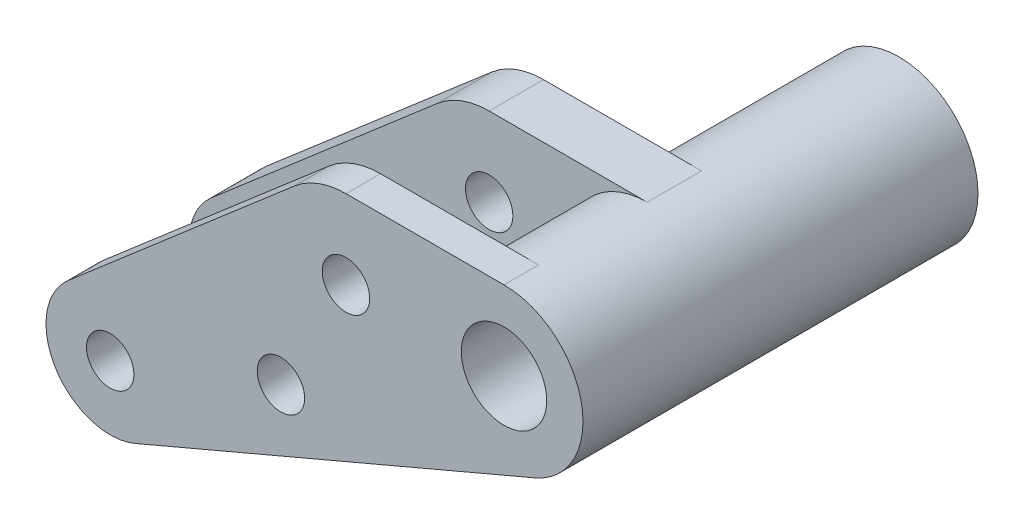
ISO-10303-21;
HEADER;
FILE_DESCRIPTION(('STEP AP214'),'2;1');
FILE_NAME('part.step','',(''),(''),'','','');
FILE_SCHEMA(('AUTOMOTIVE_DESIGN { 1 0 10303 214 1 1 1 1 }'));
ENDSEC;
DATA;
#1=APPLICATION_CONTEXT('core data for automotive mechanical design processes');
#2=APPLICATION_PROTOCOL_DEFINITION('international standard','automotive_design',2000,#1);
#3=PRODUCT_CONTEXT('',#1,'mechanical');
#4=PRODUCT('Part','Part','',(#3));
#5=PRODUCT_RELATED_PRODUCT_CATEGORY('part','',(#4));
#6=PRODUCT_DEFINITION_FORMATION('','',#4);
#7=PRODUCT_DEFINITION_CONTEXT('part definition',#1,'design');
#8=PRODUCT_DEFINITION('design','',#6,#7);
#9=PRODUCT_DEFINITION_SHAPE('','',#8);
#10=(LENGTH_UNIT() NAMED_UNIT(*) SI_UNIT(.MILLI.,.METRE.));
#11=(NAMED_UNIT(*) PLANE_ANGLE_UNIT() SI_UNIT($,.RADIAN.));
#12=(NAMED_UNIT(*) SI_UNIT($,.STERADIAN.) SOLID_ANGLE_UNIT());
#13=UNCERTAINTY_MEASURE_WITH_UNIT(LENGTH_MEASURE(1.E-05),#10,'distance_accuracy_value','');
#14=(GEOMETRIC_REPRESENTATION_CONTEXT(3) GLOBAL_UNCERTAINTY_ASSIGNED_CONTEXT((#13)) GLOBAL_UNIT_ASSIGNED_CONTEXT((#10,
#11,#12)) REPRESENTATION_CONTEXT('',''));
#15=CARTESIAN_POINT('',(0.,0.,0.));
#16=DIRECTION('',(0.,0.,1.));
#17=DIRECTION('',(1.,0.,0.));
#18=AXIS2_PLACEMENT_3D('',#15,#16,#17);
#19=CARTESIAN_POINT('',(-12.7,0.,-15.875));
#20=DIRECTION('',(0.,0.,1.));
#21=DIRECTION('',(1.,0.,0.));
#22=AXIS2_PLACEMENT_3D('',#19,#20,#21);
#23=CYLINDRICAL_SURFACE('',#22,6.35);
#24=DIRECTION('',(0.,0.,1.));
#25=VECTOR('',#24,1.);
#26=CARTESIAN_POINT('',(-16.8451479640385,4.81043120273306,-15.875));
#27=LINE('',#26,#25);
#28=CARTESIAN_POINT('',(-16.8451479640385,4.81043120273306,-15.875));
#29=VERTEX_POINT('',#28);
#30=CARTESIAN_POINT('',(-16.8451479640385,4.81043120273306,-11.509375));
#31=VERTEX_POINT('',#30);
#32=EDGE_CURVE('E117',#29,#31,#27,.T.);
#33=ORIENTED_EDGE('',*,*,#32,.T.);
#34=CARTESIAN_POINT('',(-12.7,0.,-11.509375));
#35=DIRECTION('',(0.,0.,1.));
#36=DIRECTION('',(1.,0.,0.));
#37=AXIS2_PLACEMENT_3D('',#34,#35,#36);
#38=CIRCLE('',#37,6.35);
#39=CARTESIAN_POINT('',(-12.7,6.35,-11.509375));
#40=VERTEX_POINT('',#39);
#41=EDGE_CURVE('E310',#40,#31,#38,.T.);
#42=ORIENTED_EDGE('',*,*,#41,.F.);
#43=DIRECTION('',(0.,0.,1.));
#44=VECTOR('',#43,1.);
#45=CARTESIAN_POINT('',(-12.7,6.35,-15.875));
#46=LINE('',#45,#44);
#47=CARTESIAN_POINT('',(-12.7,6.35,-15.875));
#48=VERTEX_POINT('',#47);
#49=EDGE_CURVE('E57',#48,#40,#46,.T.);
#50=ORIENTED_EDGE('',*,*,#49,.F.);
#51=CARTESIAN_POINT('',(-12.7,0.,-15.875));
#52=DIRECTION('',(0.,0.,1.));
#53=DIRECTION('',(1.,0.,0.));
#54=AXIS2_PLACEMENT_3D('',#51,#52,#53);
#55=CIRCLE('',#54,6.35);
#56=EDGE_CURVE('E164',#48,#29,#55,.T.);
#57=ORIENTED_EDGE('',*,*,#56,.T.);
#58=EDGE_LOOP('',(#33,#42,#50,#57));
#59=FACE_BOUND('',#58,.T.);
#60=ADVANCED_FACE('F47',(#59),#23,.T.);
#61=CARTESIAN_POINT('',(-12.7,6.35,-15.875));
#62=DIRECTION('',(0.,1.,0.));
#63=DIRECTION('',(0.,0.,1.));
#64=AXIS2_PLACEMENT_3D('',#61,#62,#63);
#65=PLANE('',#64);
#66=ORIENTED_EDGE('',*,*,#49,.T.);
#67=DIRECTION('',(-1.,0.,0.));
#68=VECTOR('',#67,1.);
#69=CARTESIAN_POINT('',(0.,6.35,-11.509375));
#70=LINE('',#69,#68);
#71=CARTESIAN_POINT('',(0.,6.35,-11.509375));
#72=VERTEX_POINT('',#71);
#73=EDGE_CURVE('E253',#72,#40,#70,.T.);
#74=ORIENTED_EDGE('',*,*,#73,.F.);
#75=DIRECTION('',(0.,0.,1.));
#76=VECTOR('',#75,1.);
#77=CARTESIAN_POINT('',(0.,6.35,-15.875));
#78=LINE('',#77,#76);
#79=CARTESIAN_POINT('',(0.,6.35,-15.875));
#80=VERTEX_POINT('',#79);
#81=EDGE_CURVE('E193',#80,#72,#78,.T.);
#82=ORIENTED_EDGE('',*,*,#81,.F.);
#83=DIRECTION('',(-1.,0.,0.));
#84=VECTOR('',#83,1.);
#85=CARTESIAN_POINT('',(-12.7,6.35,-15.875));
#86=LINE('',#85,#84);
#87=EDGE_CURVE('E154',#80,#48,#86,.T.);
#88=ORIENTED_EDGE('',*,*,#87,.T.);
#89=EDGE_LOOP('',(#66,#74,#82,#88));
#90=FACE_BOUND('',#89,.T.);
#91=ADVANCED_FACE('F248',(#90),#65,.T.);
#92=CARTESIAN_POINT('',(-31.652799462255,-14.759942791294,-15.875));
#93=DIRECTION('',(0.,0.,1.));
#94=DIRECTION('',(1.,0.,0.));
#95=AXIS2_PLACEMENT_3D('',#92,#93,#94);
#96=CYLINDRICAL_SURFACE('',#95,5.159375);
#97=DIRECTION('',(0.,0.,1.));
#98=VECTOR('',#97,1.);
#99=CARTESIAN_POINT('',(-29.6330292512172,-19.5075399398766,-15.875));
#100=LINE('',#99,#98);
#101=CARTESIAN_POINT('',(-29.6330292512172,-19.5075399398766,-15.875));
#102=VERTEX_POINT('',#101);
#103=CARTESIAN_POINT('',(-29.6330292512172,-19.5075399398766,-11.509375));
#104=VERTEX_POINT('',#103);
#105=EDGE_CURVE('E131',#102,#104,#100,.T.);
#106=ORIENTED_EDGE('',*,*,#105,.T.);
#107=CARTESIAN_POINT('',(-31.652799462255,-14.759942791294,-11.509375));
#108=DIRECTION('',(0.,0.,1.));
#109=DIRECTION('',(1.,0.,0.));
#110=AXIS2_PLACEMENT_3D('',#107,#108,#109);
#111=CIRCLE('',#110,5.159375);
#112=CARTESIAN_POINT('',(-35.0207321830362,-10.8514674390734,-11.509375));
#113=VERTEX_POINT('',#112);
#114=EDGE_CURVE('E275',#113,#104,#111,.T.);
#115=ORIENTED_EDGE('',*,*,#114,.F.);
#116=DIRECTION('',(0.,0.,1.));
#117=VECTOR('',#116,1.);
#118=CARTESIAN_POINT('',(-35.0207321830362,-10.8514674390734,-15.875));
#119=LINE('',#118,#117);
#120=CARTESIAN_POINT('',(-35.0207321830362,-10.8514674390734,-15.875));
#121=VERTEX_POINT('',#120);
#122=EDGE_CURVE('E158',#121,#113,#119,.T.);
#123=ORIENTED_EDGE('',*,*,#122,.F.);
#124=CARTESIAN_POINT('',(-31.652799462255,-14.759942791294,-15.875));
#125=DIRECTION('',(0.,0.,1.));
#126=DIRECTION('',(1.,0.,0.));
#127=AXIS2_PLACEMENT_3D('',#124,#125,#126);
#128=CIRCLE('',#127,5.159375);
#129=EDGE_CURVE('E150',#121,#102,#128,.T.);
#130=ORIENTED_EDGE('',*,*,#129,.T.);
#131=EDGE_LOOP('',(#106,#115,#123,#130));
#132=FACE_BOUND('',#131,.T.);
#133=ADVANCED_FACE('F156',(#132),#96,.T.);
#134=CARTESIAN_POINT('',(-35.0207321830362,-10.8514674390734,-15.875));
#135=DIRECTION('',(-0.652779206935191,0.757548220902843,0.));
#136=DIRECTION('',(-0.757548220902844,-0.652779206935191,0.));
#137=AXIS2_PLACEMENT_3D('',#134,#135,#136);
#138=PLANE('',#137);
#139=ORIENTED_EDGE('',*,*,#122,.T.);
#140=DIRECTION('',(-0.757548220902844,-0.652779206935191,0.));
#141=VECTOR('',#140,1.);
#142=CARTESIAN_POINT('',(-16.8451479640385,4.81043120273306,-11.509375));
#143=LINE('',#142,#141);
#144=EDGE_CURVE('E301',#31,#113,#143,.T.);
#145=ORIENTED_EDGE('',*,*,#144,.F.);
#146=ORIENTED_EDGE('',*,*,#32,.F.);
#147=DIRECTION('',(-0.757548220902844,-0.652779206935191,0.));
#148=VECTOR('',#147,1.);
#149=CARTESIAN_POINT('',(-35.0207321830362,-10.8514674390734,-15.875));
#150=LINE('',#149,#148);
#151=EDGE_CURVE('E160',#29,#121,#150,.T.);
#152=ORIENTED_EDGE('',*,*,#151,.T.);
#153=EDGE_LOOP('',(#139,#145,#146,#152));
#154=FACE_BOUND('',#153,.T.);
#155=ADVANCED_FACE('F433',(#154),#138,.T.);
#156=CARTESIAN_POINT('',(-12.7,0.,-15.875));
#157=DIRECTION('',(0.,0.,1.));
#158=DIRECTION('',(1.,0.,0.));
#159=AXIS2_PLACEMENT_3D('',#156,#157,#158);
#160=CYLINDRICAL_SURFACE('',#159,1.905);
#161=CARTESIAN_POINT('',(-12.7,0.,-15.875));
#162=DIRECTION('',(0.,0.,1.));
#163=DIRECTION('',(1.,0.,0.));
#164=AXIS2_PLACEMENT_3D('',#161,#162,#163);
#165=CIRCLE('',#164,1.905);
#166=CARTESIAN_POINT('',(-10.795,0.,-15.875));
#167=VERTEX_POINT('',#166);
#168=EDGE_CURVE('E176',#167,#167,#165,.T.);
#169=ORIENTED_EDGE('',*,*,#168,.F.);
#170=EDGE_LOOP('',(#169));
#171=FACE_BOUND('',#170,.T.);
#172=CARTESIAN_POINT('',(-12.7,0.,-11.509375));
#173=DIRECTION('',(0.,0.,1.));
#174=DIRECTION('',(1.,0.,0.));
#175=AXIS2_PLACEMENT_3D('',#172,#173,#174);
#176=CIRCLE('',#175,1.905);
#177=CARTESIAN_POINT('',(-10.795,0.,-11.509375));
#178=VERTEX_POINT('',#177);
#179=EDGE_CURVE('E212',#178,#178,#176,.F.);
#180=ORIENTED_EDGE('',*,*,#179,.F.);
#181=EDGE_LOOP('',(#180));
#182=FACE_BOUND('',#181,.T.);
#183=ADVANCED_FACE('F426',(#171,#182),#160,.F.);
#184=CARTESIAN_POINT('',(-31.652799462255,-14.759942791294,-15.875));
#185=DIRECTION('',(0.,0.,1.));
#186=DIRECTION('',(1.,0.,0.));
#187=AXIS2_PLACEMENT_3D('',#184,#185,#186);
#188=CYLINDRICAL_SURFACE('',#187,1.905);
#189=CARTESIAN_POINT('',(-31.652799462255,-14.759942791294,-15.875));
#190=DIRECTION('',(0.,0.,1.));
#191=DIRECTION('',(1.,0.,0.));
#192=AXIS2_PLACEMENT_3D('',#189,#190,#191);
#193=CIRCLE('',#192,1.905);
#194=CARTESIAN_POINT('',(-29.747799462255,-14.759942791294,-15.875));
#195=VERTEX_POINT('',#194);
#196=EDGE_CURVE('E233',#195,#195,#193,.T.);
#197=ORIENTED_EDGE('',*,*,#196,.F.);
#198=EDGE_LOOP('',(#197));
#199=FACE_BOUND('',#198,.T.);
#200=CARTESIAN_POINT('',(-31.652799462255,-14.759942791294,-11.509375));
#201=DIRECTION('',(0.,0.,1.));
#202=DIRECTION('',(1.,0.,0.));
#203=AXIS2_PLACEMENT_3D('',#200,#201,#202);
#204=CIRCLE('',#203,1.905);
#205=CARTESIAN_POINT('',(-29.747799462255,-14.759942791294,-11.509375));
#206=VERTEX_POINT('',#205);
#207=EDGE_CURVE('E209',#206,#206,#204,.F.);
#208=ORIENTED_EDGE('',*,*,#207,.F.);
#209=EDGE_LOOP('',(#208));
#210=FACE_BOUND('',#209,.T.);
#211=ADVANCED_FACE('F421',(#199,#210),#188,.F.);
#212=CARTESIAN_POINT('',(-12.7,0.,-2.778125));
#213=DIRECTION('',(0.,0.,1.));
#214=DIRECTION('',(1.,0.,0.));
#215=AXIS2_PLACEMENT_3D('',#212,#213,#214);
#216=CIRCLE('',#215,6.35);
#217=CARTESIAN_POINT('',(-12.7,6.35,-2.778125));
#218=VERTEX_POINT('',#217);
#219=CARTESIAN_POINT('',(-16.8451479640385,4.81043120273306,-2.778125));
#220=VERTEX_POINT('',#219);
#221=EDGE_CURVE('E334',#218,#220,#216,.T.);
#222=ORIENTED_EDGE('',*,*,#221,.T.);
#223=CARTESIAN_POINT('',(-16.8451479640385,4.81043120273306,0.));
#224=VERTEX_POINT('',#223);
#225=EDGE_CURVE('E171',#220,#224,#27,.T.);
#226=ORIENTED_EDGE('',*,*,#225,.T.);
#227=CARTESIAN_POINT('',(-12.7,0.,0.));
#228=DIRECTION('',(0.,0.,1.));
#229=DIRECTION('',(1.,0.,0.));
#230=AXIS2_PLACEMENT_3D('',#227,#228,#229);
#231=CIRCLE('',#230,6.35);
#232=CARTESIAN_POINT('',(-12.7,6.35,0.));
#233=VERTEX_POINT('',#232);
#234=EDGE_CURVE('E172',#233,#224,#231,.T.);
#235=ORIENTED_EDGE('',*,*,#234,.F.);
#236=EDGE_CURVE('E106',#218,#233,#46,.T.);
#237=ORIENTED_EDGE('',*,*,#236,.F.);
#238=EDGE_LOOP('',(#222,#226,#235,#237));
#239=FACE_BOUND('',#238,.T.);
#240=ADVANCED_FACE('F49',(#239),#23,.T.);
#241=DIRECTION('',(-1.,0.,0.));
#242=VECTOR('',#241,1.);
#243=CARTESIAN_POINT('',(0.,6.35,-2.778125));
#244=LINE('',#243,#242);
#245=CARTESIAN_POINT('',(0.,6.35,-2.778125));
#246=VERTEX_POINT('',#245);
#247=EDGE_CURVE('E333',#246,#218,#244,.T.);
#248=ORIENTED_EDGE('',*,*,#247,.T.);
#249=ORIENTED_EDGE('',*,*,#236,.T.);
#250=DIRECTION('',(-1.,0.,0.));
#251=VECTOR('',#250,1.);
#252=CARTESIAN_POINT('',(-12.7,6.35,0.));
#253=LINE('',#252,#251);
#254=CARTESIAN_POINT('',(0.,6.35,0.));
#255=VERTEX_POINT('',#254);
#256=EDGE_CURVE('E188',#255,#233,#253,.T.);
#257=ORIENTED_EDGE('',*,*,#256,.F.);
#258=EDGE_CURVE('E197',#246,#255,#78,.T.);
#259=ORIENTED_EDGE('',*,*,#258,.F.);
#260=EDGE_LOOP('',(#248,#249,#257,#259));
#261=FACE_BOUND('',#260,.T.);
#262=ADVANCED_FACE('F419',(#261),#65,.T.);
#263=CARTESIAN_POINT('',(0.,0.,-15.875));
#264=DIRECTION('',(0.,0.,1.));
#265=DIRECTION('',(1.,0.,0.));
#266=AXIS2_PLACEMENT_3D('',#263,#264,#265);
#267=CYLINDRICAL_SURFACE('',#266,6.35);
#268=CARTESIAN_POINT('',(0.,0.,0.));
#269=DIRECTION('',(0.,0.,1.));
#270=DIRECTION('',(1.,0.,0.));
#271=AXIS2_PLACEMENT_3D('',#268,#269,#270);
#272=CIRCLE('',#271,6.35);
#273=CARTESIAN_POINT('',(2.48587102896954,-5.84319649056319,0.));
#274=VERTEX_POINT('',#273);
#275=EDGE_CURVE('E185',#274,#255,#272,.T.);
#276=ORIENTED_EDGE('',*,*,#275,.F.);
#277=DIRECTION('',(0.,0.,1.));
#278=VECTOR('',#277,1.);
#279=CARTESIAN_POINT('',(2.48587102896954,-5.84319649056319,-15.875));
#280=LINE('',#279,#278);
#281=CARTESIAN_POINT('',(2.48587102896954,-5.84319649056319,-15.875));
#282=VERTEX_POINT('',#281);
#283=EDGE_CURVE('E143',#282,#274,#280,.T.);
#284=ORIENTED_EDGE('',*,*,#283,.F.);
#285=CARTESIAN_POINT('',(0.,0.,-15.875));
#286=DIRECTION('',(0.,0.,-1.));
#287=DIRECTION('',(-1.,0.,0.));
#288=AXIS2_PLACEMENT_3D('',#285,#286,#287);
#289=CIRCLE('',#288,6.35);
#290=EDGE_CURVE('E12',#282,#80,#289,.T.);
#291=ORIENTED_EDGE('',*,*,#290,.T.);
#292=ORIENTED_EDGE('',*,*,#81,.T.);
#293=CARTESIAN_POINT('',(0.,0.,-11.509375));
#294=DIRECTION('',(0.,0.,-1.));
#295=DIRECTION('',(1.,0.,0.));
#296=AXIS2_PLACEMENT_3D('',#293,#294,#295);
#297=CIRCLE('',#296,6.35);
#298=CARTESIAN_POINT('',(-6.35,0.,-11.509375));
#299=VERTEX_POINT('',#298);
#300=EDGE_CURVE('E396',#299,#72,#297,.T.);
#301=ORIENTED_EDGE('',*,*,#300,.F.);
#302=DIRECTION('',(0.,0.,1.));
#303=VECTOR('',#302,1.);
#304=CARTESIAN_POINT('',(-6.35,0.,-11.509375));
#305=LINE('',#304,#303);
#306=CARTESIAN_POINT('',(-6.35,0.,-2.778125));
#307=VERTEX_POINT('',#306);
#308=EDGE_CURVE('E208',#299,#307,#305,.T.);
#309=ORIENTED_EDGE('',*,*,#308,.T.);
#310=CARTESIAN_POINT('',(0.,0.,-2.778125));
#311=DIRECTION('',(0.,0.,-1.));
#312=DIRECTION('',(1.,0.,0.));
#313=AXIS2_PLACEMENT_3D('',#310,#311,#312);
#314=CIRCLE('',#313,6.35);
#315=EDGE_CURVE('E330',#307,#246,#314,.T.);
#316=ORIENTED_EDGE('',*,*,#315,.T.);
#317=ORIENTED_EDGE('',*,*,#258,.T.);
#318=EDGE_LOOP('',(#276,#284,#291,#292,#301,#309,#316,#317));
#319=FACE_BOUND('',#318,.T.);
#320=CARTESIAN_POINT('',(0.,0.,-31.75));
#321=DIRECTION('',(0.,0.,1.));
#322=DIRECTION('',(1.,0.,0.));
#323=AXIS2_PLACEMENT_3D('',#320,#321,#322);
#324=CIRCLE('',#323,6.35);
#325=CARTESIAN_POINT('',(6.35,0.,-31.75));
#326=VERTEX_POINT('',#325);
#327=EDGE_CURVE('E617',#326,#326,#324,.T.);
#328=ORIENTED_EDGE('',*,*,#327,.T.);
#329=EDGE_LOOP('',(#328));
#330=FACE_BOUND('',#329,.T.);
#331=ADVANCED_FACE('F260',(#319,#330),#267,.T.);
#332=CARTESIAN_POINT('',(-29.6330292512172,-19.5075399398766,-15.875));
#333=DIRECTION('',(0.391475752593628,-0.920188423710738,0.));
#334=DIRECTION('',(0.920188423710738,0.391475752593628,0.));
#335=AXIS2_PLACEMENT_3D('',#332,#333,#334);
#336=PLANE('',#335);
#337=DIRECTION('',(0.920188423710738,0.391475752593628,0.));
#338=VECTOR('',#337,1.);
#339=CARTESIAN_POINT('',(-29.6330292512172,-19.5075399398766,0.));
#340=LINE('',#339,#338);
#341=CARTESIAN_POINT('',(-29.6330292512172,-19.5075399398766,0.));
#342=VERTEX_POINT('',#341);
#343=EDGE_CURVE('E182',#342,#274,#340,.T.);
#344=ORIENTED_EDGE('',*,*,#343,.F.);
#345=CARTESIAN_POINT('',(-29.6330292512172,-19.5075399398766,-2.778125));
#346=VERTEX_POINT('',#345);
#347=EDGE_CURVE('E144',#346,#342,#100,.T.);
#348=ORIENTED_EDGE('',*,*,#347,.F.);
#349=DIRECTION('',(0.,0.,1.));
#350=VECTOR('',#349,1.);
#351=CARTESIAN_POINT('',(-29.6330292512172,-19.5075399398766,-11.509375));
#352=LINE('',#351,#350);
#353=EDGE_CURVE('E138',#104,#346,#352,.T.);
#354=ORIENTED_EDGE('',*,*,#353,.F.);
#355=ORIENTED_EDGE('',*,*,#105,.F.);
#356=DIRECTION('',(0.920188423710738,0.391475752593628,0.));
#357=VECTOR('',#356,1.);
#358=CARTESIAN_POINT('',(-29.6330292512172,-19.5075399398766,-15.875));
#359=LINE('',#358,#357);
#360=EDGE_CURVE('E135',#102,#282,#359,.T.);
#361=ORIENTED_EDGE('',*,*,#360,.T.);
#362=ORIENTED_EDGE('',*,*,#283,.T.);
#363=EDGE_LOOP('',(#344,#348,#354,#355,#361,#362));
#364=FACE_BOUND('',#363,.T.);
#365=ADVANCED_FACE('F134',(#364),#336,.T.);
#366=CARTESIAN_POINT('',(-31.652799462255,-14.759942791294,-2.778125));
#367=DIRECTION('',(0.,0.,1.));
#368=DIRECTION('',(1.,0.,0.));
#369=AXIS2_PLACEMENT_3D('',#366,#367,#368);
#370=CIRCLE('',#369,5.159375);
#371=CARTESIAN_POINT('',(-35.0207321830362,-10.8514674390734,-2.778125));
#372=VERTEX_POINT('',#371);
#373=EDGE_CURVE('E65',#372,#346,#370,.T.);
#374=ORIENTED_EDGE('',*,*,#373,.T.);
#375=ORIENTED_EDGE('',*,*,#347,.T.);
#376=CARTESIAN_POINT('',(-31.652799462255,-14.759942791294,0.));
#377=DIRECTION('',(0.,0.,1.));
#378=DIRECTION('',(1.,0.,0.));
#379=AXIS2_PLACEMENT_3D('',#376,#377,#378);
#380=CIRCLE('',#379,5.159375);
#381=CARTESIAN_POINT('',(-35.0207321830362,-10.8514674390734,0.));
#382=VERTEX_POINT('',#381);
#383=EDGE_CURVE('E179',#382,#342,#380,.T.);
#384=ORIENTED_EDGE('',*,*,#383,.F.);
#385=EDGE_CURVE('E202',#372,#382,#119,.T.);
#386=ORIENTED_EDGE('',*,*,#385,.F.);
#387=EDGE_LOOP('',(#374,#375,#384,#386));
#388=FACE_BOUND('',#387,.T.);
#389=ADVANCED_FACE('F269',(#388),#96,.T.);
#390=DIRECTION('',(-0.757548220902844,-0.652779206935191,0.));
#391=VECTOR('',#390,1.);
#392=CARTESIAN_POINT('',(-16.8451479640385,4.81043120273306,-2.778125));
#393=LINE('',#392,#391);
#394=EDGE_CURVE('E278',#220,#372,#393,.T.);
#395=ORIENTED_EDGE('',*,*,#394,.T.);
#396=ORIENTED_EDGE('',*,*,#385,.T.);
#397=DIRECTION('',(-0.757548220902844,-0.652779206935191,0.));
#398=VECTOR('',#397,1.);
#399=CARTESIAN_POINT('',(-35.0207321830362,-10.8514674390734,0.));
#400=LINE('',#399,#398);
#401=EDGE_CURVE('E175',#224,#382,#400,.T.);
#402=ORIENTED_EDGE('',*,*,#401,.F.);
#403=ORIENTED_EDGE('',*,*,#225,.F.);
#404=EDGE_LOOP('',(#395,#396,#402,#403));
#405=FACE_BOUND('',#404,.T.);
#406=ADVANCED_FACE('F343',(#405),#138,.T.);
#407=CARTESIAN_POINT('',(-12.7,0.,-15.875));
#408=DIRECTION('',(0.,0.,1.));
#409=DIRECTION('',(1.,0.,0.));
#410=AXIS2_PLACEMENT_3D('',#407,#408,#409);
#411=PLANE('',#410);
#412=CARTESIAN_POINT('',(-17.930468190698,-9.5603718788741,-15.875));
#413=DIRECTION('',(0.,0.,-1.));
#414=DIRECTION('',(-1.,0.,0.));
#415=AXIS2_PLACEMENT_3D('',#412,#413,#414);
#416=CIRCLE('',#415,2.286);
#417=CARTESIAN_POINT('',(-20.216468190698,-9.5603718788741,-15.875));
#418=VERTEX_POINT('',#417);
#419=EDGE_CURVE('E605',#418,#418,#416,.T.);
#420=ORIENTED_EDGE('',*,*,#419,.F.);
#421=EDGE_LOOP('',(#420));
#422=FACE_BOUND('',#421,.T.);
#423=ORIENTED_EDGE('',*,*,#290,.F.);
#424=ORIENTED_EDGE('',*,*,#360,.F.);
#425=ORIENTED_EDGE('',*,*,#129,.F.);
#426=ORIENTED_EDGE('',*,*,#151,.F.);
#427=ORIENTED_EDGE('',*,*,#56,.F.);
#428=ORIENTED_EDGE('',*,*,#87,.F.);
#429=EDGE_LOOP('',(#423,#424,#425,#426,#427,#428));
#430=FACE_BOUND('',#429,.T.);
#431=ORIENTED_EDGE('',*,*,#196,.T.);
#432=EDGE_LOOP('',(#431));
#433=FACE_BOUND('',#432,.T.);
#434=ORIENTED_EDGE('',*,*,#168,.T.);
#435=EDGE_LOOP('',(#434));
#436=FACE_BOUND('',#435,.T.);
#437=ADVANCED_FACE('F148',(#422,#430,#433,#436),#411,.F.);
#438=CARTESIAN_POINT('',(-12.7,0.,0.));
#439=DIRECTION('',(0.,0.,1.));
#440=DIRECTION('',(1.,0.,0.));
#441=AXIS2_PLACEMENT_3D('',#438,#439,#440);
#442=PLANE('',#441);
#443=CARTESIAN_POINT('',(-17.930468190698,-9.5603718788741,0.));
#444=DIRECTION('',(0.,0.,-1.));
#445=DIRECTION('',(-1.,0.,0.));
#446=AXIS2_PLACEMENT_3D('',#443,#444,#445);
#447=CIRCLE('',#446,1.905);
#448=CARTESIAN_POINT('',(-19.835468190698,-9.5603718788741,0.));
#449=VERTEX_POINT('',#448);
#450=EDGE_CURVE('E613',#449,#449,#447,.T.);
#451=ORIENTED_EDGE('',*,*,#450,.T.);
#452=EDGE_LOOP('',(#451));
#453=FACE_BOUND('',#452,.T.);
#454=CARTESIAN_POINT('',(0.,0.,0.));
#455=DIRECTION('',(0.,0.,1.));
#456=DIRECTION('',(1.,0.,0.));
#457=AXIS2_PLACEMENT_3D('',#454,#455,#456);
#458=CIRCLE('',#457,3.429);
#459=CARTESIAN_POINT('',(3.429,0.,0.));
#460=VERTEX_POINT('',#459);
#461=EDGE_CURVE('E229',#460,#460,#458,.T.);
#462=ORIENTED_EDGE('',*,*,#461,.F.);
#463=EDGE_LOOP('',(#462));
#464=FACE_BOUND('',#463,.T.);
#465=CARTESIAN_POINT('',(-31.652799462255,-14.759942791294,0.));
#466=DIRECTION('',(0.,0.,1.));
#467=DIRECTION('',(1.,0.,0.));
#468=AXIS2_PLACEMENT_3D('',#465,#466,#467);
#469=CIRCLE('',#468,1.905);
#470=CARTESIAN_POINT('',(-29.747799462255,-14.759942791294,0.));
#471=VERTEX_POINT('',#470);
#472=EDGE_CURVE('E232',#471,#471,#469,.T.);
#473=ORIENTED_EDGE('',*,*,#472,.F.);
#474=EDGE_LOOP('',(#473));
#475=FACE_BOUND('',#474,.T.);
#476=CARTESIAN_POINT('',(-12.7,0.,0.));
#477=DIRECTION('',(0.,0.,1.));
#478=DIRECTION('',(1.,0.,0.));
#479=AXIS2_PLACEMENT_3D('',#476,#477,#478);
#480=CIRCLE('',#479,1.905);
#481=CARTESIAN_POINT('',(-10.795,0.,0.));
#482=VERTEX_POINT('',#481);
#483=EDGE_CURVE('E236',#482,#482,#480,.T.);
#484=ORIENTED_EDGE('',*,*,#483,.F.);
#485=EDGE_LOOP('',(#484));
#486=FACE_BOUND('',#485,.T.);
#487=ORIENTED_EDGE('',*,*,#234,.T.);
#488=ORIENTED_EDGE('',*,*,#401,.T.);
#489=ORIENTED_EDGE('',*,*,#383,.T.);
#490=ORIENTED_EDGE('',*,*,#343,.T.);
#491=ORIENTED_EDGE('',*,*,#275,.T.);
#492=ORIENTED_EDGE('',*,*,#256,.T.);
#493=EDGE_LOOP('',(#487,#488,#489,#490,#491,#492));
#494=FACE_BOUND('',#493,.T.);
#495=ADVANCED_FACE('F265',(#453,#464,#475,#486,#494),#442,.T.);
#496=CARTESIAN_POINT('',(-12.7,0.,-2.778125));
#497=DIRECTION('',(0.,0.,1.));
#498=DIRECTION('',(1.,0.,0.));
#499=AXIS2_PLACEMENT_3D('',#496,#497,#498);
#500=CIRCLE('',#499,1.905);
#501=CARTESIAN_POINT('',(-10.795,0.,-2.778125));
#502=VERTEX_POINT('',#501);
#503=EDGE_CURVE('E207',#502,#502,#500,.F.);
#504=ORIENTED_EDGE('',*,*,#503,.T.);
#505=EDGE_LOOP('',(#504));
#506=FACE_BOUND('',#505,.T.);
#507=ORIENTED_EDGE('',*,*,#483,.T.);
#508=EDGE_LOOP('',(#507));
#509=FACE_BOUND('',#508,.T.);
#510=ADVANCED_FACE('F436',(#506,#509),#160,.F.);
#511=CARTESIAN_POINT('',(-31.652799462255,-14.759942791294,-2.778125));
#512=DIRECTION('',(0.,0.,1.));
#513=DIRECTION('',(1.,0.,0.));
#514=AXIS2_PLACEMENT_3D('',#511,#512,#513);
#515=CIRCLE('',#514,1.905);
#516=CARTESIAN_POINT('',(-29.747799462255,-14.759942791294,-2.778125));
#517=VERTEX_POINT('',#516);
#518=EDGE_CURVE('E205',#517,#517,#515,.F.);
#519=ORIENTED_EDGE('',*,*,#518,.T.);
#520=EDGE_LOOP('',(#519));
#521=FACE_BOUND('',#520,.T.);
#522=ORIENTED_EDGE('',*,*,#472,.T.);
#523=EDGE_LOOP('',(#522));
#524=FACE_BOUND('',#523,.T.);
#525=ADVANCED_FACE('F429',(#521,#524),#188,.F.);
#526=CARTESIAN_POINT('',(0.,0.,-15.875));
#527=DIRECTION('',(0.,0.,1.));
#528=DIRECTION('',(1.,0.,0.));
#529=AXIS2_PLACEMENT_3D('',#526,#527,#528);
#530=CYLINDRICAL_SURFACE('',#529,3.429);
#531=ORIENTED_EDGE('',*,*,#461,.T.);
#532=EDGE_LOOP('',(#531));
#533=FACE_BOUND('',#532,.T.);
#534=CARTESIAN_POINT('',(0.,0.,-31.75));
#535=DIRECTION('',(0.,0.,1.));
#536=DIRECTION('',(1.,0.,0.));
#537=AXIS2_PLACEMENT_3D('',#534,#535,#536);
#538=CIRCLE('',#537,3.429);
#539=CARTESIAN_POINT('',(3.429,0.,-31.75));
#540=VERTEX_POINT('',#539);
#541=EDGE_CURVE('E323',#540,#540,#538,.T.);
#542=ORIENTED_EDGE('',*,*,#541,.F.);
#543=EDGE_LOOP('',(#542));
#544=FACE_BOUND('',#543,.T.);
#545=ADVANCED_FACE('F441',(#533,#544),#530,.F.);
#546=CARTESIAN_POINT('',(-31.652799462255,-14.759942791294,-11.509375));
#547=DIRECTION('',(0.,0.,1.));
#548=DIRECTION('',(1.,0.,0.));
#549=AXIS2_PLACEMENT_3D('',#546,#547,#548);
#550=PLANE('',#549);
#551=ORIENTED_EDGE('',*,*,#114,.T.);
#552=CARTESIAN_POINT('',(-27.0538690928202,-17.0985299390641,-11.509375));
#553=VERTEX_POINT('',#552);
#554=EDGE_CURVE('E271',#104,#553,#111,.T.);
#555=ORIENTED_EDGE('',*,*,#554,.T.);
#556=DIRECTION('',(0.453269465346123,0.891373542228419,0.));
#557=VECTOR('',#556,1.);
#558=CARTESIAN_POINT('',(-27.0538690928202,-17.0985299390641,-11.509375));
#559=LINE('',#558,#557);
#560=CARTESIAN_POINT('',(-20.2857571130197,-3.78875195738041,-11.509375));
#561=VERTEX_POINT('',#560);
#562=EDGE_CURVE('E380',#553,#561,#559,.T.);
#563=ORIENTED_EDGE('',*,*,#562,.T.);
#564=DIRECTION('',(0.927486633704287,-0.373856315046155,0.));
#565=VECTOR('',#564,1.);
#566=CARTESIAN_POINT('',(-15.0739876005431,-5.88954012402222,-11.509375));
#567=LINE('',#566,#565);
#568=CARTESIAN_POINT('',(-15.0739876005431,-5.88954012402222,-11.509375));
#569=VERTEX_POINT('',#568);
#570=EDGE_CURVE('E382',#561,#569,#567,.T.);
#571=ORIENTED_EDGE('',*,*,#570,.T.);
#572=CARTESIAN_POINT('',(-12.7,0.,-11.509375));
#573=DIRECTION('',(0.,0.,1.));
#574=DIRECTION('',(1.,0.,0.));
#575=AXIS2_PLACEMENT_3D('',#572,#573,#574);
#576=CIRCLE('',#575,6.35);
#577=EDGE_CURVE('E387',#569,#299,#576,.T.);
#578=ORIENTED_EDGE('',*,*,#577,.T.);
#579=ORIENTED_EDGE('',*,*,#300,.T.);
#580=ORIENTED_EDGE('',*,*,#73,.T.);
#581=ORIENTED_EDGE('',*,*,#41,.T.);
#582=ORIENTED_EDGE('',*,*,#144,.T.);
#583=EDGE_LOOP('',(#551,#555,#563,#571,#578,#579,#580,#581,#582));
#584=FACE_BOUND('',#583,.T.);
#585=ORIENTED_EDGE('',*,*,#207,.T.);
#586=EDGE_LOOP('',(#585));
#587=FACE_BOUND('',#586,.T.);
#588=ORIENTED_EDGE('',*,*,#179,.T.);
#589=EDGE_LOOP('',(#588));
#590=FACE_BOUND('',#589,.T.);
#591=ADVANCED_FACE('F389',(#584,#587,#590),#550,.T.);
#592=CARTESIAN_POINT('',(-31.652799462255,-14.759942791294,-2.778125));
#593=DIRECTION('',(0.,0.,1.));
#594=DIRECTION('',(1.,0.,0.));
#595=AXIS2_PLACEMENT_3D('',#592,#593,#594);
#596=PLANE('',#595);
#597=ORIENTED_EDGE('',*,*,#518,.F.);
#598=EDGE_LOOP('',(#597));
#599=FACE_BOUND('',#598,.T.);
#600=ORIENTED_EDGE('',*,*,#373,.F.);
#601=ORIENTED_EDGE('',*,*,#394,.F.);
#602=ORIENTED_EDGE('',*,*,#221,.F.);
#603=ORIENTED_EDGE('',*,*,#247,.F.);
#604=ORIENTED_EDGE('',*,*,#315,.F.);
#605=CARTESIAN_POINT('',(-12.7,0.,-2.778125));
#606=DIRECTION('',(0.,0.,1.));
#607=DIRECTION('',(1.,0.,0.));
#608=AXIS2_PLACEMENT_3D('',#605,#606,#607);
#609=CIRCLE('',#608,6.35);
#610=CARTESIAN_POINT('',(-15.0739876005431,-5.88954012402222,-2.778125));
#611=VERTEX_POINT('',#610);
#612=EDGE_CURVE('E326',#611,#307,#609,.T.);
#613=ORIENTED_EDGE('',*,*,#612,.F.);
#614=DIRECTION('',(0.927486633704287,-0.373856315046155,0.));
#615=VECTOR('',#614,1.);
#616=CARTESIAN_POINT('',(-15.0739876005431,-5.88954012402222,-2.778125));
#617=LINE('',#616,#615);
#618=CARTESIAN_POINT('',(-20.2857571130197,-3.78875195738041,-2.778125));
#619=VERTEX_POINT('',#618);
#620=EDGE_CURVE('E322',#619,#611,#617,.T.);
#621=ORIENTED_EDGE('',*,*,#620,.F.);
#622=DIRECTION('',(0.453269465346123,0.891373542228419,0.));
#623=VECTOR('',#622,1.);
#624=CARTESIAN_POINT('',(-27.0538690928202,-17.0985299390641,-2.778125));
#625=LINE('',#624,#623);
#626=CARTESIAN_POINT('',(-27.0538690928202,-17.0985299390641,-2.778125));
#627=VERTEX_POINT('',#626);
#628=EDGE_CURVE('E320',#627,#619,#625,.T.);
#629=ORIENTED_EDGE('',*,*,#628,.F.);
#630=EDGE_CURVE('E272',#346,#627,#370,.T.);
#631=ORIENTED_EDGE('',*,*,#630,.F.);
#632=EDGE_LOOP('',(#600,#601,#602,#603,#604,#613,#621,#629,#631));
#633=FACE_BOUND('',#632,.T.);
#634=ORIENTED_EDGE('',*,*,#503,.F.);
#635=EDGE_LOOP('',(#634));
#636=FACE_BOUND('',#635,.T.);
#637=ADVANCED_FACE('F344',(#599,#633,#636),#596,.F.);
#638=CARTESIAN_POINT('',(-31.652799462255,-14.759942791294,-11.509375));
#639=DIRECTION('',(0.,0.,1.));
#640=DIRECTION('',(1.,0.,0.));
#641=AXIS2_PLACEMENT_3D('',#638,#639,#640);
#642=CYLINDRICAL_SURFACE('',#641,5.159375);
#643=ORIENTED_EDGE('',*,*,#353,.T.);
#644=ORIENTED_EDGE('',*,*,#630,.T.);
#645=DIRECTION('',(0.,0.,1.));
#646=VECTOR('',#645,1.);
#647=CARTESIAN_POINT('',(-27.0538690928202,-17.0985299390641,-11.509375));
#648=LINE('',#647,#646);
#649=EDGE_CURVE('E225',#553,#627,#648,.T.);
#650=ORIENTED_EDGE('',*,*,#649,.F.);
#651=ORIENTED_EDGE('',*,*,#554,.F.);
#652=EDGE_LOOP('',(#643,#644,#650,#651));
#653=FACE_BOUND('',#652,.T.);
#654=ADVANCED_FACE('F405',(#653),#642,.F.);
#655=CARTESIAN_POINT('',(-12.7,0.,-11.509375));
#656=DIRECTION('',(0.,0.,1.));
#657=DIRECTION('',(1.,0.,0.));
#658=AXIS2_PLACEMENT_3D('',#655,#656,#657);
#659=CYLINDRICAL_SURFACE('',#658,6.35);
#660=ORIENTED_EDGE('',*,*,#612,.T.);
#661=ORIENTED_EDGE('',*,*,#308,.F.);
#662=ORIENTED_EDGE('',*,*,#577,.F.);
#663=DIRECTION('',(0.,0.,1.));
#664=VECTOR('',#663,1.);
#665=CARTESIAN_POINT('',(-15.0739876005431,-5.88954012402222,-11.509375));
#666=LINE('',#665,#664);
#667=EDGE_CURVE('E285',#569,#611,#666,.T.);
#668=ORIENTED_EDGE('',*,*,#667,.T.);
#669=EDGE_LOOP('',(#660,#661,#662,#668));
#670=FACE_BOUND('',#669,.T.);
#671=ADVANCED_FACE('F403',(#670),#659,.F.);
#672=CARTESIAN_POINT('',(-15.0739876005431,-5.88954012402222,-11.509375));
#673=DIRECTION('',(-0.373856315046155,-0.927486633704287,0.));
#674=DIRECTION('',(0.927486633704287,-0.373856315046155,0.));
#675=AXIS2_PLACEMENT_3D('',#672,#673,#674);
#676=PLANE('',#675);
#677=ORIENTED_EDGE('',*,*,#620,.T.);
#678=ORIENTED_EDGE('',*,*,#667,.F.);
#679=ORIENTED_EDGE('',*,*,#570,.F.);
#680=DIRECTION('',(0.,0.,1.));
#681=VECTOR('',#680,1.);
#682=CARTESIAN_POINT('',(-20.2857571130197,-3.78875195738041,-11.509375));
#683=LINE('',#682,#681);
#684=EDGE_CURVE('E288',#561,#619,#683,.T.);
#685=ORIENTED_EDGE('',*,*,#684,.T.);
#686=EDGE_LOOP('',(#677,#678,#679,#685));
#687=FACE_BOUND('',#686,.T.);
#688=ADVANCED_FACE('F383',(#687),#676,.F.);
#689=CARTESIAN_POINT('',(-27.0538690928202,-17.0985299390641,-11.509375));
#690=DIRECTION('',(0.89137354222842,-0.453269465346123,0.));
#691=DIRECTION('',(0.453269465346123,0.89137354222842,0.));
#692=AXIS2_PLACEMENT_3D('',#689,#690,#691);
#693=PLANE('',#692);
#694=ORIENTED_EDGE('',*,*,#628,.T.);
#695=ORIENTED_EDGE('',*,*,#684,.F.);
#696=ORIENTED_EDGE('',*,*,#562,.F.);
#697=ORIENTED_EDGE('',*,*,#649,.T.);
#698=EDGE_LOOP('',(#694,#695,#696,#697));
#699=FACE_BOUND('',#698,.T.);
#700=ADVANCED_FACE('F378',(#699),#693,.F.);
#701=CARTESIAN_POINT('',(-12.7,0.,-31.75));
#702=DIRECTION('',(0.,0.,1.));
#703=DIRECTION('',(1.,0.,0.));
#704=AXIS2_PLACEMENT_3D('',#701,#702,#703);
#705=PLANE('',#704);
#706=ORIENTED_EDGE('',*,*,#541,.T.);
#707=EDGE_LOOP('',(#706));
#708=FACE_BOUND('',#707,.T.);
#709=ORIENTED_EDGE('',*,*,#327,.F.);
#710=EDGE_LOOP('',(#709));
#711=FACE_BOUND('',#710,.T.);
#712=ADVANCED_FACE('F549',(#708,#711),#705,.F.);
#713=CARTESIAN_POINT('',(-17.930468190698,-9.5603718788741,0.));
#714=DIRECTION('',(0.,0.,-1.));
#715=DIRECTION('',(-1.,0.,0.));
#716=AXIS2_PLACEMENT_3D('',#713,#714,#715);
#717=CYLINDRICAL_SURFACE('',#716,1.905);
#718=CARTESIAN_POINT('',(-17.930468190698,-9.5603718788741,-11.509375));
#719=DIRECTION('',(0.,0.,1.));
#720=DIRECTION('',(1.,0.,0.));
#721=AXIS2_PLACEMENT_3D('',#718,#719,#720);
#722=CIRCLE('',#721,1.905);
#723=CARTESIAN_POINT('',(-16.025468190698,-9.5603718788741,-11.509375));
#724=VERTEX_POINT('',#723);
#725=EDGE_CURVE('E51',#724,#724,#722,.F.);
#726=ORIENTED_EDGE('',*,*,#725,.T.);
#727=EDGE_LOOP('',(#726));
#728=FACE_BOUND('',#727,.T.);
#729=ORIENTED_EDGE('',*,*,#450,.F.);
#730=EDGE_LOOP('',(#729));
#731=FACE_BOUND('',#730,.T.);
#732=ADVANCED_FACE('F567',(#728,#731),#717,.F.);
#733=CARTESIAN_POINT('',(-31.652799462255,-14.759942791294,-11.509375));
#734=DIRECTION('',(0.,0.,1.));
#735=DIRECTION('',(1.,0.,0.));
#736=AXIS2_PLACEMENT_3D('',#733,#734,#735);
#737=PLANE('',#736);
#738=CARTESIAN_POINT('',(-17.930468190698,-9.5603718788741,-11.509375));
#739=DIRECTION('',(0.,0.,1.));
#740=DIRECTION('',(1.,0.,0.));
#741=AXIS2_PLACEMENT_3D('',#738,#739,#740);
#742=CIRCLE('',#741,2.286);
#743=CARTESIAN_POINT('',(-15.644468190698,-9.5603718788741,-11.509375));
#744=VERTEX_POINT('',#743);
#745=EDGE_CURVE('E608',#744,#744,#742,.F.);
#746=ORIENTED_EDGE('',*,*,#745,.T.);
#747=EDGE_LOOP('',(#746));
#748=FACE_BOUND('',#747,.T.);
#749=ORIENTED_EDGE('',*,*,#725,.F.);
#750=EDGE_LOOP('',(#749));
#751=FACE_BOUND('',#750,.T.);
#752=ADVANCED_FACE('F579',(#748,#751),#737,.F.);
#753=CARTESIAN_POINT('',(-17.930468190698,-9.5603718788741,-5.04359059283021));
#754=DIRECTION('',(0.,0.,-1.));
#755=DIRECTION('',(-1.,0.,0.));
#756=AXIS2_PLACEMENT_3D('',#753,#754,#755);
#757=CYLINDRICAL_SURFACE('',#756,2.286);
#758=ORIENTED_EDGE('',*,*,#419,.T.);
#759=EDGE_LOOP('',(#758));
#760=FACE_BOUND('',#759,.T.);
#761=ORIENTED_EDGE('',*,*,#745,.F.);
#762=EDGE_LOOP('',(#761));
#763=FACE_BOUND('',#762,.T.);
#764=ADVANCED_FACE('F589',(#760,#763),#757,.F.);
#765=CLOSED_SHELL('',(#60,#91,#133,#155,#183,#211,#240,#262,#331,#365,#389,#406,#437,#495,#510,
#525,#545,#591,#637,#654,#671,#688,#700,#712,#732,#752,#764));
#766=MANIFOLD_SOLID_BREP('B2',#765);
#767=ADVANCED_BREP_SHAPE_REPRESENTATION('',(#18,#766),#14);
#768=SHAPE_DEFINITION_REPRESENTATION(#9,#767);
ENDSEC;
END-ISO-10303-21;
